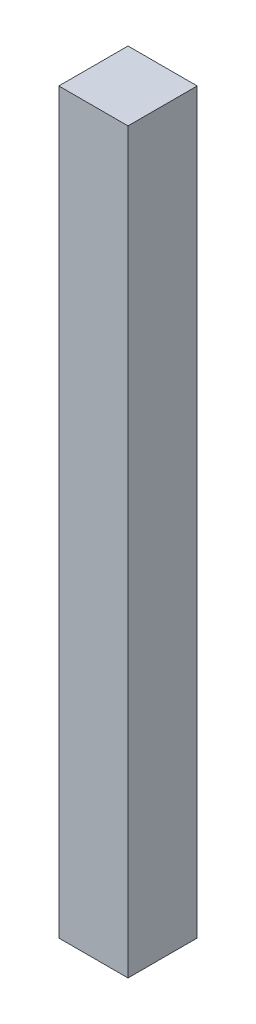
ISO-10303-21;
HEADER;
FILE_DESCRIPTION(('STEP AP214'),'2;1');
FILE_NAME('part.step','',(''),(''),'','','');
FILE_SCHEMA(('AUTOMOTIVE_DESIGN { 1 0 10303 214 1 1 1 1 }'));
ENDSEC;
DATA;
#1=APPLICATION_CONTEXT('core data for automotive mechanical design processes');
#2=APPLICATION_PROTOCOL_DEFINITION('international standard','automotive_design',2000,#1);
#3=PRODUCT_CONTEXT('',#1,'mechanical');
#4=PRODUCT('Part','Part','',(#3));
#5=PRODUCT_RELATED_PRODUCT_CATEGORY('part','',(#4));
#6=PRODUCT_DEFINITION_FORMATION('','',#4);
#7=PRODUCT_DEFINITION_CONTEXT('part definition',#1,'design');
#8=PRODUCT_DEFINITION('design','',#6,#7);
#9=PRODUCT_DEFINITION_SHAPE('','',#8);
#10=(LENGTH_UNIT() NAMED_UNIT(*) SI_UNIT(.MILLI.,.METRE.));
#11=(NAMED_UNIT(*) PLANE_ANGLE_UNIT() SI_UNIT($,.RADIAN.));
#12=(NAMED_UNIT(*) SI_UNIT($,.STERADIAN.) SOLID_ANGLE_UNIT());
#13=UNCERTAINTY_MEASURE_WITH_UNIT(LENGTH_MEASURE(1.E-05),#10,'distance_accuracy_value','');
#14=(GEOMETRIC_REPRESENTATION_CONTEXT(3) GLOBAL_UNCERTAINTY_ASSIGNED_CONTEXT((#13)) GLOBAL_UNIT_ASSIGNED_CONTEXT((#10,
#11,#12)) REPRESENTATION_CONTEXT('',''));
#15=CARTESIAN_POINT('',(0.,0.,0.));
#16=DIRECTION('',(0.,0.,1.));
#17=DIRECTION('',(1.,0.,0.));
#18=AXIS2_PLACEMENT_3D('',#15,#16,#17);
#19=CARTESIAN_POINT('',(0.,0.,19.05));
#20=DIRECTION('',(1.,0.,0.));
#21=DIRECTION('',(0.,0.,-1.));
#22=AXIS2_PLACEMENT_3D('',#19,#20,#21);
#23=PLANE('',#22);
#24=DIRECTION('',(0.,-1.,0.));
#25=VECTOR('',#24,1.);
#26=CARTESIAN_POINT('',(0.,0.,0.));
#27=LINE('',#26,#25);
#28=CARTESIAN_POINT('',(0.,203.2,0.));
#29=VERTEX_POINT('',#28);
#30=CARTESIAN_POINT('',(0.,0.,0.));
#31=VERTEX_POINT('',#30);
#32=EDGE_CURVE('E95',#29,#31,#27,.T.);
#33=ORIENTED_EDGE('',*,*,#32,.T.);
#34=DIRECTION('',(0.,0.,-1.));
#35=VECTOR('',#34,1.);
#36=CARTESIAN_POINT('',(0.,0.,19.05));
#37=LINE('',#36,#35);
#38=CARTESIAN_POINT('',(0.,0.,19.05));
#39=VERTEX_POINT('',#38);
#40=EDGE_CURVE('E11',#39,#31,#37,.T.);
#41=ORIENTED_EDGE('',*,*,#40,.F.);
#42=DIRECTION('',(0.,-1.,0.));
#43=VECTOR('',#42,1.);
#44=CARTESIAN_POINT('',(0.,0.,19.05));
#45=LINE('',#44,#43);
#46=CARTESIAN_POINT('',(0.,203.2,19.05));
#47=VERTEX_POINT('',#46);
#48=EDGE_CURVE('E83',#47,#39,#45,.T.);
#49=ORIENTED_EDGE('',*,*,#48,.F.);
#50=DIRECTION('',(0.,0.,-1.));
#51=VECTOR('',#50,1.);
#52=CARTESIAN_POINT('',(0.,203.2,19.05));
#53=LINE('',#52,#51);
#54=EDGE_CURVE('E91',#47,#29,#53,.T.);
#55=ORIENTED_EDGE('',*,*,#54,.T.);
#56=EDGE_LOOP('',(#33,#41,#49,#55));
#57=FACE_BOUND('',#56,.T.);
#58=ADVANCED_FACE('F32',(#57),#23,.F.);
#59=CARTESIAN_POINT('',(0.,0.,19.05));
#60=DIRECTION('',(0.,1.,0.));
#61=DIRECTION('',(0.,0.,1.));
#62=AXIS2_PLACEMENT_3D('',#59,#60,#61);
#63=PLANE('',#62);
#64=DIRECTION('',(1.,0.,0.));
#65=VECTOR('',#64,1.);
#66=CARTESIAN_POINT('',(0.,0.,0.));
#67=LINE('',#66,#65);
#68=CARTESIAN_POINT('',(19.05,0.,0.));
#69=VERTEX_POINT('',#68);
#70=EDGE_CURVE('E87',#31,#69,#67,.T.);
#71=ORIENTED_EDGE('',*,*,#70,.T.);
#72=DIRECTION('',(0.,0.,-1.));
#73=VECTOR('',#72,1.);
#74=CARTESIAN_POINT('',(19.05,0.,19.05));
#75=LINE('',#74,#73);
#76=CARTESIAN_POINT('',(19.05,0.,19.05));
#77=VERTEX_POINT('',#76);
#78=EDGE_CURVE('E40',#77,#69,#75,.T.);
#79=ORIENTED_EDGE('',*,*,#78,.F.);
#80=DIRECTION('',(1.,0.,0.));
#81=VECTOR('',#80,1.);
#82=CARTESIAN_POINT('',(0.,0.,19.05));
#83=LINE('',#82,#81);
#84=EDGE_CURVE('E78',#39,#77,#83,.T.);
#85=ORIENTED_EDGE('',*,*,#84,.F.);
#86=ORIENTED_EDGE('',*,*,#40,.T.);
#87=EDGE_LOOP('',(#71,#79,#85,#86));
#88=FACE_BOUND('',#87,.T.);
#89=ADVANCED_FACE('F86',(#88),#63,.F.);
#90=CARTESIAN_POINT('',(19.05,0.,19.05));
#91=DIRECTION('',(-1.,0.,0.));
#92=DIRECTION('',(0.,0.,1.));
#93=AXIS2_PLACEMENT_3D('',#90,#91,#92);
#94=PLANE('',#93);
#95=DIRECTION('',(0.,1.,0.));
#96=VECTOR('',#95,1.);
#97=CARTESIAN_POINT('',(19.05,0.,0.));
#98=LINE('',#97,#96);
#99=CARTESIAN_POINT('',(19.05,203.2,0.));
#100=VERTEX_POINT('',#99);
#101=EDGE_CURVE('E65',#69,#100,#98,.T.);
#102=ORIENTED_EDGE('',*,*,#101,.T.);
#103=DIRECTION('',(0.,0.,-1.));
#104=VECTOR('',#103,1.);
#105=CARTESIAN_POINT('',(19.05,203.2,19.05));
#106=LINE('',#105,#104);
#107=CARTESIAN_POINT('',(19.05,203.2,19.05));
#108=VERTEX_POINT('',#107);
#109=EDGE_CURVE('E88',#108,#100,#106,.T.);
#110=ORIENTED_EDGE('',*,*,#109,.F.);
#111=DIRECTION('',(0.,1.,0.));
#112=VECTOR('',#111,1.);
#113=CARTESIAN_POINT('',(19.05,0.,19.05));
#114=LINE('',#113,#112);
#115=EDGE_CURVE('E81',#77,#108,#114,.T.);
#116=ORIENTED_EDGE('',*,*,#115,.F.);
#117=ORIENTED_EDGE('',*,*,#78,.T.);
#118=EDGE_LOOP('',(#102,#110,#116,#117));
#119=FACE_BOUND('',#118,.T.);
#120=ADVANCED_FACE('F89',(#119),#94,.F.);
#121=CARTESIAN_POINT('',(0.,203.2,19.05));
#122=DIRECTION('',(0.,-1.,0.));
#123=DIRECTION('',(0.,0.,-1.));
#124=AXIS2_PLACEMENT_3D('',#121,#122,#123);
#125=PLANE('',#124);
#126=DIRECTION('',(-1.,0.,0.));
#127=VECTOR('',#126,1.);
#128=CARTESIAN_POINT('',(0.,203.2,0.));
#129=LINE('',#128,#127);
#130=EDGE_CURVE('E71',#100,#29,#129,.T.);
#131=ORIENTED_EDGE('',*,*,#130,.T.);
#132=ORIENTED_EDGE('',*,*,#54,.F.);
#133=DIRECTION('',(-1.,0.,0.));
#134=VECTOR('',#133,1.);
#135=CARTESIAN_POINT('',(0.,203.2,19.05));
#136=LINE('',#135,#134);
#137=EDGE_CURVE('E48',#108,#47,#136,.T.);
#138=ORIENTED_EDGE('',*,*,#137,.F.);
#139=ORIENTED_EDGE('',*,*,#109,.T.);
#140=EDGE_LOOP('',(#131,#132,#138,#139));
#141=FACE_BOUND('',#140,.T.);
#142=ADVANCED_FACE('F102',(#141),#125,.F.);
#143=CARTESIAN_POINT('',(0.,0.,19.05));
#144=DIRECTION('',(0.,0.,-1.));
#145=DIRECTION('',(-1.,0.,0.));
#146=AXIS2_PLACEMENT_3D('',#143,#144,#145);
#147=PLANE('',#146);
#148=ORIENTED_EDGE('',*,*,#48,.T.);
#149=ORIENTED_EDGE('',*,*,#84,.T.);
#150=ORIENTED_EDGE('',*,*,#115,.T.);
#151=ORIENTED_EDGE('',*,*,#137,.T.);
#152=EDGE_LOOP('',(#148,#149,#150,#151));
#153=FACE_BOUND('',#152,.T.);
#154=ADVANCED_FACE('F79',(#153),#147,.F.);
#155=CARTESIAN_POINT('',(0.,0.,0.));
#156=DIRECTION('',(0.,0.,-1.));
#157=DIRECTION('',(-1.,0.,0.));
#158=AXIS2_PLACEMENT_3D('',#155,#156,#157);
#159=PLANE('',#158);
#160=ORIENTED_EDGE('',*,*,#32,.F.);
#161=ORIENTED_EDGE('',*,*,#130,.F.);
#162=ORIENTED_EDGE('',*,*,#101,.F.);
#163=ORIENTED_EDGE('',*,*,#70,.F.);
#164=EDGE_LOOP('',(#160,#161,#162,#163));
#165=FACE_BOUND('',#164,.T.);
#166=ADVANCED_FACE('F105',(#165),#159,.T.);
#167=CLOSED_SHELL('',(#58,#89,#120,#142,#154,#166));
#168=MANIFOLD_SOLID_BREP('B2',#167);
#169=ADVANCED_BREP_SHAPE_REPRESENTATION('',(#18,#168),#14);
#170=SHAPE_DEFINITION_REPRESENTATION(#9,#169);
ENDSEC;
END-ISO-10303-21;
